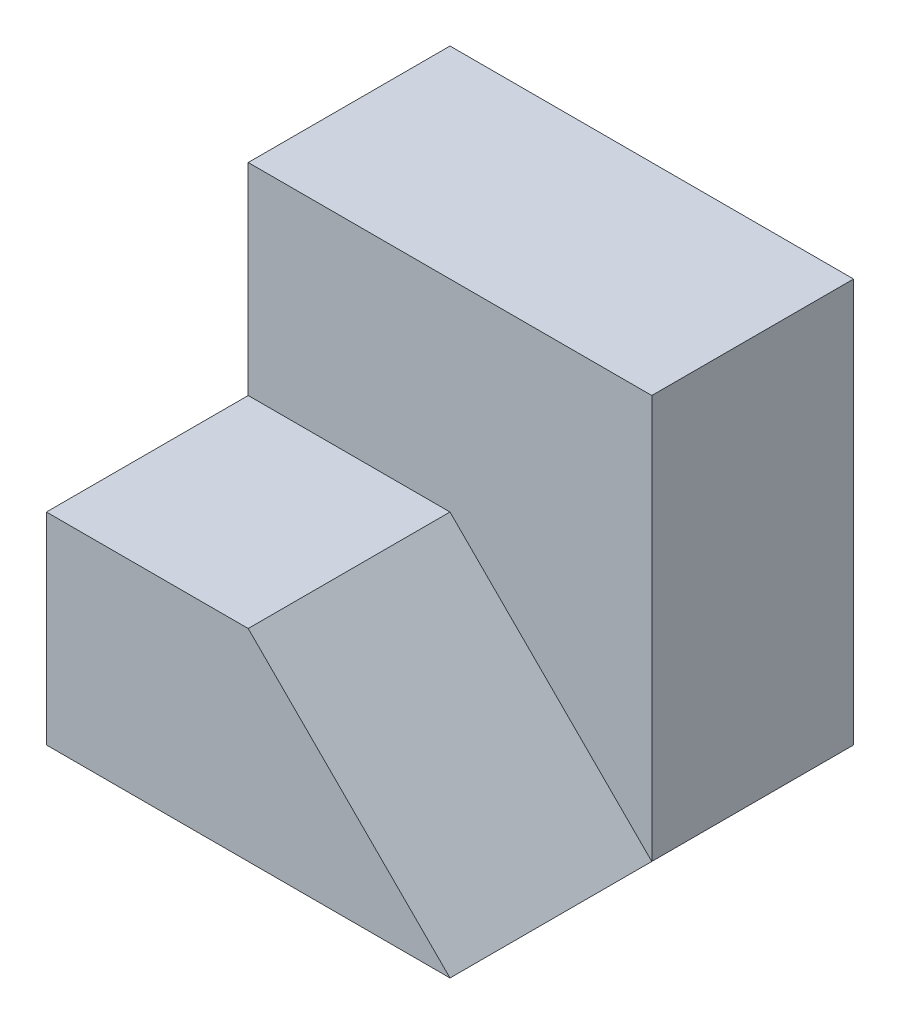
ISO-10303-21;
HEADER;
FILE_DESCRIPTION(('STEP AP214'),'2;1');
FILE_NAME('part.step','',(''),(''),'','','');
FILE_SCHEMA(('AUTOMOTIVE_DESIGN { 1 0 10303 214 1 1 1 1 }'));
ENDSEC;
DATA;
#1=APPLICATION_CONTEXT('core data for automotive mechanical design processes');
#2=APPLICATION_PROTOCOL_DEFINITION('international standard','automotive_design',2000,#1);
#3=PRODUCT_CONTEXT('',#1,'mechanical');
#4=PRODUCT('Part','Part','',(#3));
#5=PRODUCT_RELATED_PRODUCT_CATEGORY('part','',(#4));
#6=PRODUCT_DEFINITION_FORMATION('','',#4);
#7=PRODUCT_DEFINITION_CONTEXT('part definition',#1,'design');
#8=PRODUCT_DEFINITION('design','',#6,#7);
#9=PRODUCT_DEFINITION_SHAPE('','',#8);
#10=(LENGTH_UNIT() NAMED_UNIT(*) SI_UNIT(.MILLI.,.METRE.));
#11=(NAMED_UNIT(*) PLANE_ANGLE_UNIT() SI_UNIT($,.RADIAN.));
#12=(NAMED_UNIT(*) SI_UNIT($,.STERADIAN.) SOLID_ANGLE_UNIT());
#13=UNCERTAINTY_MEASURE_WITH_UNIT(LENGTH_MEASURE(1.E-05),#10,'distance_accuracy_value','');
#14=(GEOMETRIC_REPRESENTATION_CONTEXT(3) GLOBAL_UNCERTAINTY_ASSIGNED_CONTEXT((#13)) GLOBAL_UNIT_ASSIGNED_CONTEXT((#10,
#11,#12)) REPRESENTATION_CONTEXT('',''));
#15=CARTESIAN_POINT('',(0.,0.,0.));
#16=DIRECTION('',(0.,0.,1.));
#17=DIRECTION('',(1.,0.,0.));
#18=AXIS2_PLACEMENT_3D('',#15,#16,#17);
#19=CARTESIAN_POINT('',(0.,0.,30.));
#20=DIRECTION('',(1.,0.,0.));
#21=DIRECTION('',(0.,0.,-1.));
#22=AXIS2_PLACEMENT_3D('',#19,#20,#21);
#23=PLANE('',#22);
#24=DIRECTION('',(0.,0.,-1.));
#25=VECTOR('',#24,1.);
#26=CARTESIAN_POINT('',(0.,30.,30.));
#27=LINE('',#26,#25);
#28=CARTESIAN_POINT('',(0.,30.,30.));
#29=VERTEX_POINT('',#28);
#30=CARTESIAN_POINT('',(0.,30.,0.));
#31=VERTEX_POINT('',#30);
#32=EDGE_CURVE('E134',#29,#31,#27,.T.);
#33=ORIENTED_EDGE('',*,*,#32,.T.);
#34=DIRECTION('',(0.,1.,0.));
#35=VECTOR('',#34,1.);
#36=CARTESIAN_POINT('',(0.,0.,0.));
#37=LINE('',#36,#35);
#38=CARTESIAN_POINT('',(0.,60.,0.));
#39=VERTEX_POINT('',#38);
#40=EDGE_CURVE('E154',#31,#39,#37,.T.);
#41=ORIENTED_EDGE('',*,*,#40,.T.);
#42=DIRECTION('',(0.,0.,1.));
#43=VECTOR('',#42,1.);
#44=CARTESIAN_POINT('',(0.,60.,-30.));
#45=LINE('',#44,#43);
#46=CARTESIAN_POINT('',(0.,60.,-30.));
#47=VERTEX_POINT('',#46);
#48=EDGE_CURVE('E118',#47,#39,#45,.T.);
#49=ORIENTED_EDGE('',*,*,#48,.F.);
#50=DIRECTION('',(0.,1.,0.));
#51=VECTOR('',#50,1.);
#52=CARTESIAN_POINT('',(0.,0.,-30.));
#53=LINE('',#52,#51);
#54=CARTESIAN_POINT('',(0.,0.,-30.));
#55=VERTEX_POINT('',#54);
#56=EDGE_CURVE('E101',#55,#47,#53,.T.);
#57=ORIENTED_EDGE('',*,*,#56,.F.);
#58=DIRECTION('',(0.,0.,-1.));
#59=VECTOR('',#58,1.);
#60=CARTESIAN_POINT('',(0.,0.,30.));
#61=LINE('',#60,#59);
#62=CARTESIAN_POINT('',(0.,0.,30.));
#63=VERTEX_POINT('',#62);
#64=EDGE_CURVE('E11',#63,#55,#61,.T.);
#65=ORIENTED_EDGE('',*,*,#64,.F.);
#66=DIRECTION('',(0.,-1.,0.));
#67=VECTOR('',#66,1.);
#68=CARTESIAN_POINT('',(0.,0.,30.));
#69=LINE('',#68,#67);
#70=EDGE_CURVE('E128',#29,#63,#69,.T.);
#71=ORIENTED_EDGE('',*,*,#70,.F.);
#72=EDGE_LOOP('',(#33,#41,#49,#57,#65,#71));
#73=FACE_BOUND('',#72,.T.);
#74=ADVANCED_FACE('F41',(#73),#23,.F.);
#75=CARTESIAN_POINT('',(0.,0.,30.));
#76=DIRECTION('',(0.,1.,0.));
#77=DIRECTION('',(0.,0.,1.));
#78=AXIS2_PLACEMENT_3D('',#75,#76,#77);
#79=PLANE('',#78);
#80=ORIENTED_EDGE('',*,*,#64,.T.);
#81=DIRECTION('',(-1.,0.,0.));
#82=VECTOR('',#81,1.);
#83=CARTESIAN_POINT('',(60.,0.,-30.));
#84=LINE('',#83,#82);
#85=CARTESIAN_POINT('',(60.,0.,-30.));
#86=VERTEX_POINT('',#85);
#87=EDGE_CURVE('E91',#86,#55,#84,.T.);
#88=ORIENTED_EDGE('',*,*,#87,.F.);
#89=DIRECTION('',(0.,0.,1.));
#90=VECTOR('',#89,1.);
#91=CARTESIAN_POINT('',(60.,0.,-30.));
#92=LINE('',#91,#90);
#93=CARTESIAN_POINT('',(60.,0.,0.));
#94=VERTEX_POINT('',#93);
#95=EDGE_CURVE('E96',#86,#94,#92,.T.);
#96=ORIENTED_EDGE('',*,*,#95,.T.);
#97=DIRECTION('',(0.,0.,-1.));
#98=VECTOR('',#97,1.);
#99=CARTESIAN_POINT('',(60.,0.,30.));
#100=LINE('',#99,#98);
#101=CARTESIAN_POINT('',(60.,0.,30.));
#102=VERTEX_POINT('',#101);
#103=EDGE_CURVE('E49',#102,#94,#100,.T.);
#104=ORIENTED_EDGE('',*,*,#103,.F.);
#105=DIRECTION('',(1.,0.,0.));
#106=VECTOR('',#105,1.);
#107=CARTESIAN_POINT('',(0.,0.,30.));
#108=LINE('',#107,#106);
#109=EDGE_CURVE('E130',#63,#102,#108,.T.);
#110=ORIENTED_EDGE('',*,*,#109,.F.);
#111=EDGE_LOOP('',(#80,#88,#96,#104,#110));
#112=FACE_BOUND('',#111,.T.);
#113=ADVANCED_FACE('F93',(#112),#79,.F.);
#114=CARTESIAN_POINT('',(30.,30.,30.));
#115=DIRECTION('',(-0.707106781186547,-0.707106781186547,0.));
#116=DIRECTION('',(0.707106781186548,-0.707106781186548,0.));
#117=AXIS2_PLACEMENT_3D('',#114,#115,#116);
#118=PLANE('',#117);
#119=DIRECTION('',(-0.707106781186547,0.707106781186547,0.));
#120=VECTOR('',#119,1.);
#121=CARTESIAN_POINT('',(30.,30.,0.));
#122=LINE('',#121,#120);
#123=CARTESIAN_POINT('',(30.,30.,0.));
#124=VERTEX_POINT('',#123);
#125=EDGE_CURVE('E117',#94,#124,#122,.T.);
#126=ORIENTED_EDGE('',*,*,#125,.T.);
#127=DIRECTION('',(0.,0.,-1.));
#128=VECTOR('',#127,1.);
#129=CARTESIAN_POINT('',(30.,30.,30.));
#130=LINE('',#129,#128);
#131=CARTESIAN_POINT('',(30.,30.,30.));
#132=VERTEX_POINT('',#131);
#133=EDGE_CURVE('E140',#132,#124,#130,.T.);
#134=ORIENTED_EDGE('',*,*,#133,.F.);
#135=DIRECTION('',(-0.707106781186547,0.707106781186547,0.));
#136=VECTOR('',#135,1.);
#137=CARTESIAN_POINT('',(30.,30.,30.));
#138=LINE('',#137,#136);
#139=EDGE_CURVE('E132',#102,#132,#138,.T.);
#140=ORIENTED_EDGE('',*,*,#139,.F.);
#141=ORIENTED_EDGE('',*,*,#103,.T.);
#142=EDGE_LOOP('',(#126,#134,#140,#141));
#143=FACE_BOUND('',#142,.T.);
#144=ADVANCED_FACE('F144',(#143),#118,.F.);
#145=CARTESIAN_POINT('',(0.,30.,30.));
#146=DIRECTION('',(0.,-1.,0.));
#147=DIRECTION('',(0.,0.,-1.));
#148=AXIS2_PLACEMENT_3D('',#145,#146,#147);
#149=PLANE('',#148);
#150=DIRECTION('',(-1.,0.,0.));
#151=VECTOR('',#150,1.);
#152=CARTESIAN_POINT('',(0.,30.,0.));
#153=LINE('',#152,#151);
#154=EDGE_CURVE('E121',#124,#31,#153,.T.);
#155=ORIENTED_EDGE('',*,*,#154,.T.);
#156=ORIENTED_EDGE('',*,*,#32,.F.);
#157=DIRECTION('',(-1.,0.,0.));
#158=VECTOR('',#157,1.);
#159=CARTESIAN_POINT('',(0.,30.,30.));
#160=LINE('',#159,#158);
#161=EDGE_CURVE('E56',#132,#29,#160,.T.);
#162=ORIENTED_EDGE('',*,*,#161,.F.);
#163=ORIENTED_EDGE('',*,*,#133,.T.);
#164=EDGE_LOOP('',(#155,#156,#162,#163));
#165=FACE_BOUND('',#164,.T.);
#166=ADVANCED_FACE('F162',(#165),#149,.F.);
#167=CARTESIAN_POINT('',(0.,0.,30.));
#168=DIRECTION('',(0.,0.,-1.));
#169=DIRECTION('',(-1.,0.,0.));
#170=AXIS2_PLACEMENT_3D('',#167,#168,#169);
#171=PLANE('',#170);
#172=ORIENTED_EDGE('',*,*,#70,.T.);
#173=ORIENTED_EDGE('',*,*,#109,.T.);
#174=ORIENTED_EDGE('',*,*,#139,.T.);
#175=ORIENTED_EDGE('',*,*,#161,.T.);
#176=EDGE_LOOP('',(#172,#173,#174,#175));
#177=FACE_BOUND('',#176,.T.);
#178=ADVANCED_FACE('F147',(#177),#171,.F.);
#179=CARTESIAN_POINT('',(0.,0.,0.));
#180=DIRECTION('',(0.,0.,1.));
#181=DIRECTION('',(1.,0.,0.));
#182=AXIS2_PLACEMENT_3D('',#179,#180,#181);
#183=PLANE('',#182);
#184=ORIENTED_EDGE('',*,*,#154,.F.);
#185=ORIENTED_EDGE('',*,*,#125,.F.);
#186=DIRECTION('',(0.,-1.,0.));
#187=VECTOR('',#186,1.);
#188=CARTESIAN_POINT('',(60.,0.,0.));
#189=LINE('',#188,#187);
#190=CARTESIAN_POINT('',(60.,60.,0.));
#191=VERTEX_POINT('',#190);
#192=EDGE_CURVE('E115',#191,#94,#189,.T.);
#193=ORIENTED_EDGE('',*,*,#192,.F.);
#194=DIRECTION('',(1.,0.,0.));
#195=VECTOR('',#194,1.);
#196=CARTESIAN_POINT('',(60.,60.,0.));
#197=LINE('',#196,#195);
#198=EDGE_CURVE('E111',#39,#191,#197,.T.);
#199=ORIENTED_EDGE('',*,*,#198,.F.);
#200=ORIENTED_EDGE('',*,*,#40,.F.);
#201=EDGE_LOOP('',(#184,#185,#193,#199,#200));
#202=FACE_BOUND('',#201,.T.);
#203=ADVANCED_FACE('F160',(#202),#183,.T.);
#204=CARTESIAN_POINT('',(60.,0.,-30.));
#205=DIRECTION('',(-1.,0.,0.));
#206=DIRECTION('',(0.,0.,1.));
#207=AXIS2_PLACEMENT_3D('',#204,#205,#206);
#208=PLANE('',#207);
#209=ORIENTED_EDGE('',*,*,#192,.T.);
#210=ORIENTED_EDGE('',*,*,#95,.F.);
#211=DIRECTION('',(0.,-1.,0.));
#212=VECTOR('',#211,1.);
#213=CARTESIAN_POINT('',(60.,0.,-30.));
#214=LINE('',#213,#212);
#215=CARTESIAN_POINT('',(60.,60.,-30.));
#216=VERTEX_POINT('',#215);
#217=EDGE_CURVE('E102',#216,#86,#214,.T.);
#218=ORIENTED_EDGE('',*,*,#217,.F.);
#219=DIRECTION('',(0.,0.,1.));
#220=VECTOR('',#219,1.);
#221=CARTESIAN_POINT('',(60.,60.,-30.));
#222=LINE('',#221,#220);
#223=EDGE_CURVE('E124',#216,#191,#222,.T.);
#224=ORIENTED_EDGE('',*,*,#223,.T.);
#225=EDGE_LOOP('',(#209,#210,#218,#224));
#226=FACE_BOUND('',#225,.T.);
#227=ADVANCED_FACE('F113',(#226),#208,.F.);
#228=CARTESIAN_POINT('',(60.,60.,-30.));
#229=DIRECTION('',(0.,-1.,0.));
#230=DIRECTION('',(0.,0.,-1.));
#231=AXIS2_PLACEMENT_3D('',#228,#229,#230);
#232=PLANE('',#231);
#233=ORIENTED_EDGE('',*,*,#198,.T.);
#234=ORIENTED_EDGE('',*,*,#223,.F.);
#235=DIRECTION('',(1.,0.,0.));
#236=VECTOR('',#235,1.);
#237=CARTESIAN_POINT('',(60.,60.,-30.));
#238=LINE('',#237,#236);
#239=EDGE_CURVE('E107',#47,#216,#238,.T.);
#240=ORIENTED_EDGE('',*,*,#239,.F.);
#241=ORIENTED_EDGE('',*,*,#48,.T.);
#242=EDGE_LOOP('',(#233,#234,#240,#241));
#243=FACE_BOUND('',#242,.T.);
#244=ADVANCED_FACE('F163',(#243),#232,.F.);
#245=CARTESIAN_POINT('',(0.,0.,-30.));
#246=DIRECTION('',(0.,0.,1.));
#247=DIRECTION('',(1.,0.,0.));
#248=AXIS2_PLACEMENT_3D('',#245,#246,#247);
#249=PLANE('',#248);
#250=ORIENTED_EDGE('',*,*,#217,.T.);
#251=ORIENTED_EDGE('',*,*,#87,.T.);
#252=ORIENTED_EDGE('',*,*,#56,.T.);
#253=ORIENTED_EDGE('',*,*,#239,.T.);
#254=EDGE_LOOP('',(#250,#251,#252,#253));
#255=FACE_BOUND('',#254,.T.);
#256=ADVANCED_FACE('F105',(#255),#249,.F.);
#257=CLOSED_SHELL('',(#74,#113,#144,#166,#178,#203,#227,#244,#256));
#258=MANIFOLD_SOLID_BREP('B2',#257);
#259=ADVANCED_BREP_SHAPE_REPRESENTATION('',(#18,#258),#14);
#260=SHAPE_DEFINITION_REPRESENTATION(#9,#259);
ENDSEC;
END-ISO-10303-21;
